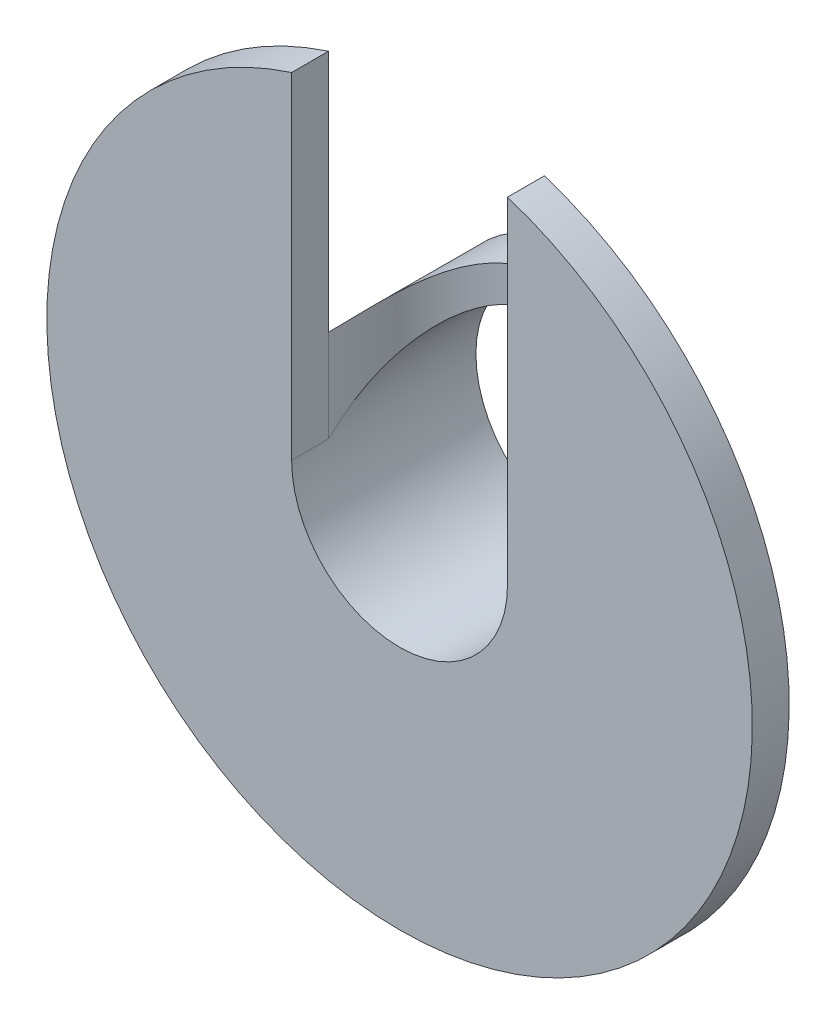
ISO-10303-21;
HEADER;
FILE_DESCRIPTION(('STEP AP214'),'2;1');
FILE_NAME('part.step','',(''),(''),'','','');
FILE_SCHEMA(('AUTOMOTIVE_DESIGN { 1 0 10303 214 1 1 1 1 }'));
ENDSEC;
DATA;
#1=APPLICATION_CONTEXT('core data for automotive mechanical design processes');
#2=APPLICATION_PROTOCOL_DEFINITION('international standard','automotive_design',2000,#1);
#3=PRODUCT_CONTEXT('',#1,'mechanical');
#4=PRODUCT('Part','Part','',(#3));
#5=PRODUCT_RELATED_PRODUCT_CATEGORY('part','',(#4));
#6=PRODUCT_DEFINITION_FORMATION('','',#4);
#7=PRODUCT_DEFINITION_CONTEXT('part definition',#1,'design');
#8=PRODUCT_DEFINITION('design','',#6,#7);
#9=PRODUCT_DEFINITION_SHAPE('','',#8);
#10=(LENGTH_UNIT() NAMED_UNIT(*) SI_UNIT(.MILLI.,.METRE.));
#11=(NAMED_UNIT(*) PLANE_ANGLE_UNIT() SI_UNIT($,.RADIAN.));
#12=(NAMED_UNIT(*) SI_UNIT($,.STERADIAN.) SOLID_ANGLE_UNIT());
#13=UNCERTAINTY_MEASURE_WITH_UNIT(LENGTH_MEASURE(1.E-05),#10,'distance_accuracy_value','');
#14=(GEOMETRIC_REPRESENTATION_CONTEXT(3) GLOBAL_UNCERTAINTY_ASSIGNED_CONTEXT((#13)) GLOBAL_UNIT_ASSIGNED_CONTEXT((#10,
#11,#12)) REPRESENTATION_CONTEXT('',''));
#15=CARTESIAN_POINT('',(0.,0.,0.));
#16=DIRECTION('',(0.,0.,1.));
#17=DIRECTION('',(1.,0.,0.));
#18=AXIS2_PLACEMENT_3D('',#15,#16,#17);
#19=CARTESIAN_POINT('',(0.,0.,1.4));
#20=DIRECTION('',(0.,0.,1.));
#21=DIRECTION('',(1.,0.,0.));
#22=AXIS2_PLACEMENT_3D('',#19,#20,#21);
#23=PLANE('',#22);
#24=DIRECTION('',(0.,-1.,0.));
#25=VECTOR('',#24,1.);
#26=CARTESIAN_POINT('',(4.1,0.,1.4));
#27=LINE('',#26,#25);
#28=CARTESIAN_POINT('',(4.1,12.7573508221731,1.4));
#29=VERTEX_POINT('',#28);
#30=CARTESIAN_POINT('',(4.1,0.,1.4));
#31=VERTEX_POINT('',#30);
#32=EDGE_CURVE('E87',#29,#31,#27,.T.);
#33=ORIENTED_EDGE('',*,*,#32,.T.);
#34=CARTESIAN_POINT('',(0.,0.,1.4));
#35=DIRECTION('',(0.,0.,-1.));
#36=DIRECTION('',(1.,0.,0.));
#37=AXIS2_PLACEMENT_3D('',#34,#35,#36);
#38=CIRCLE('',#37,4.1);
#39=CARTESIAN_POINT('',(-4.1,0.,1.4));
#40=VERTEX_POINT('',#39);
#41=EDGE_CURVE('E90',#31,#40,#38,.T.);
#42=ORIENTED_EDGE('',*,*,#41,.T.);
#43=DIRECTION('',(0.,1.,0.));
#44=VECTOR('',#43,1.);
#45=CARTESIAN_POINT('',(-4.1,0.,1.4));
#46=LINE('',#45,#44);
#47=CARTESIAN_POINT('',(-4.1,12.7573508221731,1.4));
#48=VERTEX_POINT('',#47);
#49=EDGE_CURVE('E107',#40,#48,#46,.T.);
#50=ORIENTED_EDGE('',*,*,#49,.T.);
#51=CARTESIAN_POINT('',(0.,0.,1.4));
#52=DIRECTION('',(0.,0.,1.));
#53=DIRECTION('',(1.,0.,0.));
#54=AXIS2_PLACEMENT_3D('',#51,#52,#53);
#55=CIRCLE('',#54,13.4);
#56=EDGE_CURVE('E54',#48,#29,#55,.T.);
#57=ORIENTED_EDGE('',*,*,#56,.T.);
#58=EDGE_LOOP('',(#33,#42,#50,#57));
#59=FACE_BOUND('',#58,.T.);
#60=ADVANCED_FACE('F32',(#59),#23,.T.);
#61=CARTESIAN_POINT('',(0.,0.,-5.6));
#62=DIRECTION('',(0.,0.,1.));
#63=DIRECTION('',(1.,0.,0.));
#64=AXIS2_PLACEMENT_3D('',#61,#62,#63);
#65=CYLINDRICAL_SURFACE('',#64,5.4);
#66=CARTESIAN_POINT('',(0.,0.,-5.6));
#67=DIRECTION('',(0.,0.,1.));
#68=DIRECTION('',(1.,0.,0.));
#69=AXIS2_PLACEMENT_3D('',#66,#67,#68);
#70=CIRCLE('',#69,5.4);
#71=CARTESIAN_POINT('',(5.4,0.,-5.6));
#72=VERTEX_POINT('',#71);
#73=EDGE_CURVE('E114',#72,#72,#70,.T.);
#74=ORIENTED_EDGE('',*,*,#73,.T.);
#75=EDGE_LOOP('',(#74));
#76=FACE_BOUND('',#75,.T.);
#77=CARTESIAN_POINT('',(0.,0.,0.));
#78=DIRECTION('',(0.,0.,1.));
#79=DIRECTION('',(1.,0.,0.));
#80=AXIS2_PLACEMENT_3D('',#77,#78,#79);
#81=CIRCLE('',#80,5.4);
#82=CARTESIAN_POINT('',(-4.1,3.51425667816112,0.));
#83=VERTEX_POINT('',#82);
#84=CARTESIAN_POINT('',(4.1,3.51425667816112,0.));
#85=VERTEX_POINT('',#84);
#86=EDGE_CURVE('E46',#83,#85,#81,.T.);
#87=ORIENTED_EDGE('',*,*,#86,.F.);
#88=CARTESIAN_POINT('',(-4.1,3.51425667816112,0.));
#89=CARTESIAN_POINT('',(-4.10003240682871,3.5141753372138,-0.0961799797142094));
#90=CARTESIAN_POINT('',(-4.09661733963796,3.518203110597,-0.192304316651131));
#91=CARTESIAN_POINT('',(-4.08315880205422,3.53383644554081,-0.383249903298068));
#92=CARTESIAN_POINT('',(-4.0731307454661,3.54542438491351,-0.478073661051183));
#93=CARTESIAN_POINT('',(-4.04689526015395,3.57533249180128,-0.664370524246586));
#94=CARTESIAN_POINT('',(-4.03077618938647,3.59355626660413,-0.755871940545818));
#95=CARTESIAN_POINT('',(-3.9927187016355,3.63579569186746,-0.936324778276143));
#96=CARTESIAN_POINT('',(-3.97077663922048,3.65981496969224,-1.02527456349243));
#97=CARTESIAN_POINT('',(-3.91617485432706,3.71826422979845,-1.21891245793592));
#98=CARTESIAN_POINT('',(-3.88222646581794,3.75382211058629,-1.32289594147094));
#99=CARTESIAN_POINT('',(-3.80693154238386,3.83016425164104,-1.52611250506262));
#100=CARTESIAN_POINT('',(-3.76558352393348,3.87094955946991,-1.62534462746971));
#101=CARTESIAN_POINT('',(-3.63067530641035,3.99919428464958,-1.91683210889973));
#102=CARTESIAN_POINT('',(-3.52655058926816,4.09220010135427,-2.10184626079823));
#103=CARTESIAN_POINT('',(-3.29013178962432,4.28472389685992,-2.45587940869536));
#104=CARTESIAN_POINT('',(-3.15727254483512,4.38433969830923,-2.62446121951576));
#105=CARTESIAN_POINT('',(-2.86602883382796,4.58002533714002,-2.93969557030927));
#106=CARTESIAN_POINT('',(-2.70769293206293,4.67610150194493,-3.08638882940216));
#107=CARTESIAN_POINT('',(-2.37312468055209,4.8541326818484,-3.34986656424083));
#108=CARTESIAN_POINT('',(-2.19791299453821,4.93650929692434,-3.46764261450353));
#109=CARTESIAN_POINT('',(-1.91935325040441,5.04838065908304,-3.62456523248921));
#110=CARTESIAN_POINT('',(-1.82381517042462,5.08373962091365,-3.67360566572547));
#111=CARTESIAN_POINT('',(-1.6278760944552,5.14982414884193,-3.76452766358431));
#112=CARTESIAN_POINT('',(-1.5274774982444,5.18055197125725,-3.80641271568605));
#113=CARTESIAN_POINT('',(-1.32134006567517,5.23694482934766,-3.88281609031488));
#114=CARTESIAN_POINT('',(-1.21555872657294,5.262557616023,-3.91725865501157));
#115=CARTESIAN_POINT('',(-1.00037865022869,5.30766572841648,-3.977652462318));
#116=CARTESIAN_POINT('',(-0.89098193693535,5.32716441487306,-4.00360837012629));
#117=CARTESIAN_POINT('',(-0.669555239859543,5.35949660384484,-4.04652974849957));
#118=CARTESIAN_POINT('',(-0.557527424622917,5.37233540692807,-4.0635023690377));
#119=CARTESIAN_POINT('',(-0.331878652858584,5.39097992023792,-4.08812058787533));
#120=CARTESIAN_POINT('',(-0.2182579894584,5.39678690776079,-4.09576788007865));
#121=CARTESIAN_POINT('',(-0.00813022300902785,5.40085407336803,-4.10112491329106));
#122=CARTESIAN_POINT('',(0.0883263789497458,5.40013594992847,-4.10017999808186));
#123=CARTESIAN_POINT('',(0.280789459640797,5.39355449855897,-4.09150807568582));
#124=CARTESIAN_POINT('',(0.376795792695383,5.38768960730058,-4.08377900781542));
#125=CARTESIAN_POINT('',(0.567557343452085,5.3709440030007,-4.06166126014958));
#126=CARTESIAN_POINT('',(0.662313034922583,5.36006524888258,-4.04727518124901));
#127=CARTESIAN_POINT('',(0.849954875148779,5.333533106338,-4.01207006388889));
#128=CARTESIAN_POINT('',(0.942840277789466,5.31787785112953,-3.99124851023539));
#129=CARTESIAN_POINT('',(1.21196141739169,5.26533418699663,-3.92105952746794));
#130=CARTESIAN_POINT('',(1.38487865394222,5.22228329835824,-3.86320998783547));
#131=CARTESIAN_POINT('',(1.71799892485398,5.12238444724599,-3.72705685635757));
#132=CARTESIAN_POINT('',(1.87819973838065,5.06553408179403,-3.64874970193484));
#133=CARTESIAN_POINT('',(2.20429046468983,4.93315298923698,-3.46277702585463));
#134=CARTESIAN_POINT('',(2.36814209201567,4.85614722529724,-3.35260112044403));
#135=CARTESIAN_POINT('',(2.67602094303086,4.69353441079688,-3.11241391738911));
#136=CARTESIAN_POINT('',(2.82002511489008,4.60791755513771,-2.98237991881656));
#137=CARTESIAN_POINT('',(3.03413454896213,4.46802971019962,-2.75997969659921));
#138=CARTESIAN_POINT('',(3.11085714927383,4.41483028298602,-2.6731930616018));
#139=CARTESIAN_POINT('',(3.25668121130817,4.30838330099929,-2.49347464859936));
#140=CARTESIAN_POINT('',(3.32578428192301,4.25513575878908,-2.40054417454356));
#141=CARTESIAN_POINT('',(3.45621992677019,4.149887674417,-2.20862266104789));
#142=CARTESIAN_POINT('',(3.51754858525764,4.09788777125994,-2.10962860449437));
#143=CARTESIAN_POINT('',(3.63206709725239,3.99673980463906,-1.90571641144267));
#144=CARTESIAN_POINT('',(3.68526009799858,3.9475906429709,-1.80080058736343));
#145=CARTESIAN_POINT('',(3.8036009608276,3.8342949077541,-1.53977344861013));
#146=CARTESIAN_POINT('',(3.86442790315623,3.77248618273261,-1.38062066081224));
#147=CARTESIAN_POINT('',(3.96657060545519,3.66495032774568,-1.05155200706579));
#148=CARTESIAN_POINT('',(4.00797304664959,3.6191519900056,-0.881687870263697));
#149=CARTESIAN_POINT('',(4.05862317019492,3.56209214585788,-0.592631372792262));
#150=CARTESIAN_POINT('',(4.07401437586105,3.54438493188098,-0.475799191766649));
#151=CARTESIAN_POINT('',(4.08954048785639,3.52643127399563,-0.29867638426933));
#152=CARTESIAN_POINT('',(4.09345602034784,3.52188062682787,-0.239124747518896));
#153=CARTESIAN_POINT('',(4.09868837923661,3.51578732118451,-0.119720824744675));
#154=CARTESIAN_POINT('',(4.10000372664243,3.51424637463979,-0.0598683870160481));
#155=CARTESIAN_POINT('',(4.1,3.51425667816112,0.));
#156=B_SPLINE_CURVE_WITH_KNOTS('',3,(#88,#89,#90,#91,#92,#93,#94,#95,#96,#97,#98,#99,#100,#101,
#102,#103,#104,#105,#106,#107,#108,#109,#110,#111,#112,#113,#114,#115,#116,#117,#118,#119,#120,
#121,#122,#123,#124,#125,#126,#127,#128,#129,#130,#131,#132,#133,#134,#135,#136,#137,#138,#139,
#140,#141,#142,#143,#144,#145,#146,#147,#148,#149,#150,#151,#152,#153,#154,#155),.UNSPECIFIED.,
.F.,.F.,(4,2,2,2,2,2,2,2,2,2,2,2,2,2,2,2,2,2,2,2,2,2,2,2,2,2,2,2,2,2,2,2,2,4),(0.,
0.288306364082311,0.575943096820415,0.859558202871275,1.14335128418805,1.48786442570481,
1.83244671496928,2.52495440542028,3.23257501156757,3.93886236919969,4.61571904970257,
4.95454814667049,5.29321162677764,5.63517502805436,5.97695013140942,6.31845279868143,
6.65989342428991,6.94891764657107,7.23802969023215,7.52702887303681,7.81614114930488,
8.37572795274824,8.93541227008498,9.56894291565726,10.2032032840728,10.5852839254067,
10.9672837338584,11.3494751864208,11.7315184141106,12.2735368766625,12.8131130363553,
13.1696311276041,13.3490702260044,13.5286113604581),.UNSPECIFIED.);
#157=EDGE_CURVE('E11',#83,#85,#156,.T.);
#158=ORIENTED_EDGE('',*,*,#157,.T.);
#159=EDGE_LOOP('',(#87,#158));
#160=FACE_BOUND('',#159,.T.);
#161=ADVANCED_FACE('F129',(#76,#160),#65,.T.);
#162=CARTESIAN_POINT('',(0.,0.,1.4));
#163=DIRECTION('',(0.,0.,-1.));
#164=DIRECTION('',(-1.,0.,0.));
#165=AXIS2_PLACEMENT_3D('',#162,#163,#164);
#166=CYLINDRICAL_SURFACE('',#165,4.1);
#167=CARTESIAN_POINT('',(0.,0.,0.));
#168=DIRECTION('',(0.,-0.707106781186547,-0.707106781186547));
#169=DIRECTION('',(0.,0.707106781186547,-0.707106781186547));
#170=AXIS2_PLACEMENT_3D('',#167,#168,#169);
#171=ELLIPSE('',#170,5.79827560572969,4.1);
#172=CARTESIAN_POINT('',(-4.1,0.,0.));
#173=VERTEX_POINT('',#172);
#174=CARTESIAN_POINT('',(4.1,0.,0.));
#175=VERTEX_POINT('',#174);
#176=EDGE_CURVE('E132',#173,#175,#171,.T.);
#177=ORIENTED_EDGE('',*,*,#176,.F.);
#178=DIRECTION('',(0.,0.,1.));
#179=VECTOR('',#178,1.);
#180=CARTESIAN_POINT('',(-4.1,0.,1.4));
#181=LINE('',#180,#179);
#182=EDGE_CURVE('E103',#173,#40,#181,.T.);
#183=ORIENTED_EDGE('',*,*,#182,.T.);
#184=ORIENTED_EDGE('',*,*,#41,.F.);
#185=DIRECTION('',(0.,0.,-1.));
#186=VECTOR('',#185,1.);
#187=CARTESIAN_POINT('',(4.1,0.,1.4));
#188=LINE('',#187,#186);
#189=EDGE_CURVE('E97',#31,#175,#188,.T.);
#190=ORIENTED_EDGE('',*,*,#189,.T.);
#191=EDGE_LOOP('',(#177,#183,#184,#190));
#192=FACE_BOUND('',#191,.T.);
#193=CARTESIAN_POINT('',(0.,0.,-5.6));
#194=DIRECTION('',(0.,0.,1.));
#195=DIRECTION('',(1.,0.,0.));
#196=AXIS2_PLACEMENT_3D('',#193,#194,#195);
#197=CIRCLE('',#196,4.1);
#198=CARTESIAN_POINT('',(4.1,0.,-5.6));
#199=VERTEX_POINT('',#198);
#200=EDGE_CURVE('E134',#199,#199,#197,.T.);
#201=ORIENTED_EDGE('',*,*,#200,.F.);
#202=EDGE_LOOP('',(#201));
#203=FACE_BOUND('',#202,.T.);
#204=ADVANCED_FACE('F34',(#192,#203),#166,.F.);
#205=CARTESIAN_POINT('',(-4.1,0.,1.4));
#206=DIRECTION('',(-1.,0.,0.));
#207=DIRECTION('',(0.,0.,1.));
#208=AXIS2_PLACEMENT_3D('',#205,#206,#207);
#209=PLANE('',#208);
#210=DIRECTION('',(0.,1.,0.));
#211=VECTOR('',#210,1.);
#212=CARTESIAN_POINT('',(-4.1,0.,0.));
#213=LINE('',#212,#211);
#214=CARTESIAN_POINT('',(-4.1,12.7573508221731,0.));
#215=VERTEX_POINT('',#214);
#216=EDGE_CURVE('E65',#83,#215,#213,.T.);
#217=ORIENTED_EDGE('',*,*,#216,.T.);
#218=DIRECTION('',(0.,0.,-1.));
#219=VECTOR('',#218,1.);
#220=CARTESIAN_POINT('',(-4.1,12.7573508221731,1.4));
#221=LINE('',#220,#219);
#222=EDGE_CURVE('E121',#48,#215,#221,.T.);
#223=ORIENTED_EDGE('',*,*,#222,.F.);
#224=ORIENTED_EDGE('',*,*,#49,.F.);
#225=ORIENTED_EDGE('',*,*,#182,.F.);
#226=DIRECTION('',(0.,-1.,0.));
#227=VECTOR('',#226,1.);
#228=CARTESIAN_POINT('',(-4.1,7.,0.));
#229=LINE('',#228,#227);
#230=EDGE_CURVE('E71',#83,#173,#229,.T.);
#231=ORIENTED_EDGE('',*,*,#230,.F.);
#232=EDGE_LOOP('',(#217,#223,#224,#225,#231));
#233=FACE_BOUND('',#232,.T.);
#234=ADVANCED_FACE('F164',(#233),#209,.F.);
#235=CARTESIAN_POINT('',(0.,0.,1.4));
#236=DIRECTION('',(0.,0.,-1.));
#237=DIRECTION('',(-1.,0.,0.));
#238=AXIS2_PLACEMENT_3D('',#235,#236,#237);
#239=CYLINDRICAL_SURFACE('',#238,13.4);
#240=CARTESIAN_POINT('',(0.,0.,0.));
#241=DIRECTION('',(0.,0.,1.));
#242=DIRECTION('',(1.,0.,0.));
#243=AXIS2_PLACEMENT_3D('',#240,#241,#242);
#244=CIRCLE('',#243,13.4);
#245=CARTESIAN_POINT('',(4.1,12.7573508221731,0.));
#246=VERTEX_POINT('',#245);
#247=EDGE_CURVE('E111',#215,#246,#244,.T.);
#248=ORIENTED_EDGE('',*,*,#247,.T.);
#249=DIRECTION('',(0.,0.,-1.));
#250=VECTOR('',#249,1.);
#251=CARTESIAN_POINT('',(4.1,12.7573508221731,1.4));
#252=LINE('',#251,#250);
#253=EDGE_CURVE('E93',#29,#246,#252,.T.);
#254=ORIENTED_EDGE('',*,*,#253,.F.);
#255=ORIENTED_EDGE('',*,*,#56,.F.);
#256=ORIENTED_EDGE('',*,*,#222,.T.);
#257=EDGE_LOOP('',(#248,#254,#255,#256));
#258=FACE_BOUND('',#257,.T.);
#259=ADVANCED_FACE('F162',(#258),#239,.T.);
#260=CARTESIAN_POINT('',(4.1,0.,1.4));
#261=DIRECTION('',(1.,0.,0.));
#262=DIRECTION('',(0.,0.,-1.));
#263=AXIS2_PLACEMENT_3D('',#260,#261,#262);
#264=PLANE('',#263);
#265=ORIENTED_EDGE('',*,*,#189,.F.);
#266=ORIENTED_EDGE('',*,*,#32,.F.);
#267=ORIENTED_EDGE('',*,*,#253,.T.);
#268=DIRECTION('',(0.,-1.,0.));
#269=VECTOR('',#268,1.);
#270=CARTESIAN_POINT('',(4.1,0.,0.));
#271=LINE('',#270,#269);
#272=EDGE_CURVE('E108',#246,#85,#271,.T.);
#273=ORIENTED_EDGE('',*,*,#272,.T.);
#274=DIRECTION('',(0.,-1.,0.));
#275=VECTOR('',#274,1.);
#276=CARTESIAN_POINT('',(4.1,7.,0.));
#277=LINE('',#276,#275);
#278=EDGE_CURVE('E100',#85,#175,#277,.T.);
#279=ORIENTED_EDGE('',*,*,#278,.T.);
#280=EDGE_LOOP('',(#265,#266,#267,#273,#279));
#281=FACE_BOUND('',#280,.T.);
#282=ADVANCED_FACE('F98',(#281),#264,.F.);
#283=CARTESIAN_POINT('',(0.,0.,0.));
#284=DIRECTION('',(0.,0.,1.));
#285=DIRECTION('',(1.,0.,0.));
#286=AXIS2_PLACEMENT_3D('',#283,#284,#285);
#287=PLANE('',#286);
#288=ORIENTED_EDGE('',*,*,#216,.F.);
#289=ORIENTED_EDGE('',*,*,#86,.T.);
#290=ORIENTED_EDGE('',*,*,#272,.F.);
#291=ORIENTED_EDGE('',*,*,#247,.F.);
#292=EDGE_LOOP('',(#288,#289,#290,#291));
#293=FACE_BOUND('',#292,.T.);
#294=ADVANCED_FACE('F126',(#293),#287,.F.);
#295=CARTESIAN_POINT('',(0.,0.,-5.6));
#296=DIRECTION('',(0.,0.,1.));
#297=DIRECTION('',(1.,0.,0.));
#298=AXIS2_PLACEMENT_3D('',#295,#296,#297);
#299=PLANE('',#298);
#300=ORIENTED_EDGE('',*,*,#200,.T.);
#301=EDGE_LOOP('',(#300));
#302=FACE_BOUND('',#301,.T.);
#303=ORIENTED_EDGE('',*,*,#73,.F.);
#304=EDGE_LOOP('',(#303));
#305=FACE_BOUND('',#304,.T.);
#306=ADVANCED_FACE('F145',(#302,#305),#299,.F.);
#307=CARTESIAN_POINT('',(0.,7.,0.));
#308=DIRECTION('',(0.,-1.,0.));
#309=DIRECTION('',(0.,0.,-1.));
#310=AXIS2_PLACEMENT_3D('',#307,#308,#309);
#311=CYLINDRICAL_SURFACE('',#310,4.1);
#312=ORIENTED_EDGE('',*,*,#176,.T.);
#313=ORIENTED_EDGE('',*,*,#278,.F.);
#314=ORIENTED_EDGE('',*,*,#157,.F.);
#315=ORIENTED_EDGE('',*,*,#230,.T.);
#316=EDGE_LOOP('',(#312,#313,#314,#315));
#317=FACE_BOUND('',#316,.T.);
#318=ADVANCED_FACE('F131',(#317),#311,.F.);
#319=CLOSED_SHELL('',(#60,#161,#204,#234,#259,#282,#294,#306,#318));
#320=MANIFOLD_SOLID_BREP('B2',#319);
#321=ADVANCED_BREP_SHAPE_REPRESENTATION('',(#18,#320),#14);
#322=SHAPE_DEFINITION_REPRESENTATION(#9,#321);
ENDSEC;
END-ISO-10303-21;
